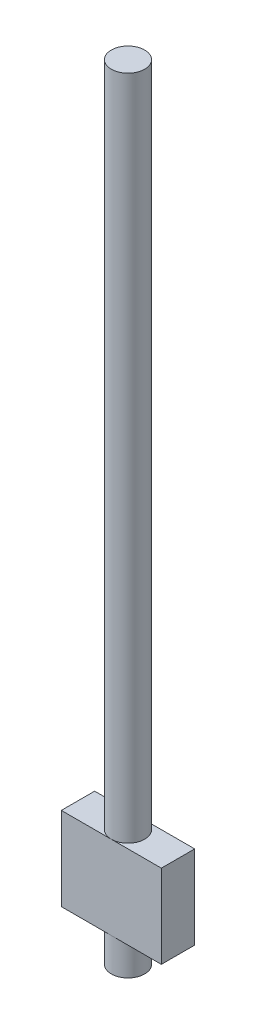
ISO-10303-21;
HEADER;
FILE_DESCRIPTION(('STEP AP214'),'2;1');
FILE_NAME('part.step','',(''),(''),'','','');
FILE_SCHEMA(('AUTOMOTIVE_DESIGN { 1 0 10303 214 1 1 1 1 }'));
ENDSEC;
DATA;
#1=APPLICATION_CONTEXT('core data for automotive mechanical design processes');
#2=APPLICATION_PROTOCOL_DEFINITION('international standard','automotive_design',2000,#1);
#3=PRODUCT_CONTEXT('',#1,'mechanical');
#4=PRODUCT('Part','Part','',(#3));
#5=PRODUCT_RELATED_PRODUCT_CATEGORY('part','',(#4));
#6=PRODUCT_DEFINITION_FORMATION('','',#4);
#7=PRODUCT_DEFINITION_CONTEXT('part definition',#1,'design');
#8=PRODUCT_DEFINITION('design','',#6,#7);
#9=PRODUCT_DEFINITION_SHAPE('','',#8);
#10=(LENGTH_UNIT() NAMED_UNIT(*) SI_UNIT(.MILLI.,.METRE.));
#11=(NAMED_UNIT(*) PLANE_ANGLE_UNIT() SI_UNIT($,.RADIAN.));
#12=(NAMED_UNIT(*) SI_UNIT($,.STERADIAN.) SOLID_ANGLE_UNIT());
#13=UNCERTAINTY_MEASURE_WITH_UNIT(LENGTH_MEASURE(1.E-05),#10,'distance_accuracy_value','');
#14=(GEOMETRIC_REPRESENTATION_CONTEXT(3) GLOBAL_UNCERTAINTY_ASSIGNED_CONTEXT((#13)) GLOBAL_UNIT_ASSIGNED_CONTEXT((#10,
#11,#12)) REPRESENTATION_CONTEXT('',''));
#15=CARTESIAN_POINT('',(0.,0.,0.));
#16=DIRECTION('',(0.,0.,1.));
#17=DIRECTION('',(1.,0.,0.));
#18=AXIS2_PLACEMENT_3D('',#15,#16,#17);
#19=CARTESIAN_POINT('',(0.,0.,0.));
#20=DIRECTION('',(0.,1.,0.));
#21=DIRECTION('',(0.,0.,1.));
#22=AXIS2_PLACEMENT_3D('',#19,#20,#21);
#23=PLANE('',#22);
#24=CARTESIAN_POINT('',(0.,0.,0.));
#25=DIRECTION('',(0.,-1.,0.));
#26=DIRECTION('',(0.,0.,-1.));
#27=AXIS2_PLACEMENT_3D('',#24,#25,#26);
#28=CIRCLE('',#27,0.5);
#29=CARTESIAN_POINT('',(0.,0.,-0.5));
#30=VERTEX_POINT('',#29);
#31=CARTESIAN_POINT('',(0.,0.,0.5));
#32=VERTEX_POINT('',#31);
#33=EDGE_CURVE('E57',#30,#32,#28,.T.);
#34=ORIENTED_EDGE('',*,*,#33,.F.);
#35=DIRECTION('',(-1.,0.,0.));
#36=VECTOR('',#35,1.);
#37=CARTESIAN_POINT('',(-1.5,0.,-0.5));
#38=LINE('',#37,#36);
#39=CARTESIAN_POINT('',(1.5,0.,-0.5));
#40=VERTEX_POINT('',#39);
#41=EDGE_CURVE('E101',#40,#30,#38,.T.);
#42=ORIENTED_EDGE('',*,*,#41,.F.);
#43=DIRECTION('',(0.,0.,-1.));
#44=VECTOR('',#43,1.);
#45=CARTESIAN_POINT('',(1.5,0.,0.5));
#46=LINE('',#45,#44);
#47=CARTESIAN_POINT('',(1.5,0.,0.5));
#48=VERTEX_POINT('',#47);
#49=EDGE_CURVE('E118',#48,#40,#46,.T.);
#50=ORIENTED_EDGE('',*,*,#49,.F.);
#51=DIRECTION('',(1.,0.,0.));
#52=VECTOR('',#51,1.);
#53=CARTESIAN_POINT('',(-1.5,0.,0.5));
#54=LINE('',#53,#52);
#55=EDGE_CURVE('E120',#32,#48,#54,.T.);
#56=ORIENTED_EDGE('',*,*,#55,.F.);
#57=EDGE_LOOP('',(#34,#42,#50,#56));
#58=FACE_BOUND('',#57,.T.);
#59=ADVANCED_FACE('F45',(#58),#23,.F.);
#60=CARTESIAN_POINT('',(0.,2.5,0.));
#61=DIRECTION('',(0.,1.,0.));
#62=DIRECTION('',(0.,0.,1.));
#63=AXIS2_PLACEMENT_3D('',#60,#61,#62);
#64=PLANE('',#63);
#65=CARTESIAN_POINT('',(0.,2.5,0.));
#66=DIRECTION('',(0.,1.,0.));
#67=DIRECTION('',(0.,0.,1.));
#68=AXIS2_PLACEMENT_3D('',#65,#66,#67);
#69=CIRCLE('',#68,0.5);
#70=CARTESIAN_POINT('',(0.,2.5,0.5));
#71=VERTEX_POINT('',#70);
#72=CARTESIAN_POINT('',(0.,2.5,-0.5));
#73=VERTEX_POINT('',#72);
#74=EDGE_CURVE('E198',#71,#73,#69,.T.);
#75=ORIENTED_EDGE('',*,*,#74,.F.);
#76=DIRECTION('',(1.,0.,0.));
#77=VECTOR('',#76,1.);
#78=CARTESIAN_POINT('',(-1.5,2.5,0.5));
#79=LINE('',#78,#77);
#80=CARTESIAN_POINT('',(1.5,2.5,0.5));
#81=VERTEX_POINT('',#80);
#82=EDGE_CURVE('E186',#71,#81,#79,.T.);
#83=ORIENTED_EDGE('',*,*,#82,.T.);
#84=DIRECTION('',(0.,0.,-1.));
#85=VECTOR('',#84,1.);
#86=CARTESIAN_POINT('',(1.5,2.5,0.5));
#87=LINE('',#86,#85);
#88=CARTESIAN_POINT('',(1.5,2.5,-0.5));
#89=VERTEX_POINT('',#88);
#90=EDGE_CURVE('E222',#81,#89,#87,.T.);
#91=ORIENTED_EDGE('',*,*,#90,.T.);
#92=DIRECTION('',(-1.,0.,0.));
#93=VECTOR('',#92,1.);
#94=CARTESIAN_POINT('',(-1.5,2.5,-0.5));
#95=LINE('',#94,#93);
#96=EDGE_CURVE('E220',#89,#73,#95,.T.);
#97=ORIENTED_EDGE('',*,*,#96,.T.);
#98=EDGE_LOOP('',(#75,#83,#91,#97));
#99=FACE_BOUND('',#98,.T.);
#100=ADVANCED_FACE('F143',(#99),#64,.T.);
#101=CARTESIAN_POINT('',(-1.5,2.5,0.5));
#102=DIRECTION('',(0.,0.,-1.));
#103=DIRECTION('',(-1.,0.,0.));
#104=AXIS2_PLACEMENT_3D('',#101,#102,#103);
#105=PLANE('',#104);
#106=CARTESIAN_POINT('',(-1.5,0.,0.5));
#107=VERTEX_POINT('',#106);
#108=EDGE_CURVE('E178',#107,#32,#54,.T.);
#109=ORIENTED_EDGE('',*,*,#108,.T.);
#110=ORIENTED_EDGE('',*,*,#55,.T.);
#111=DIRECTION('',(0.,-1.,0.));
#112=VECTOR('',#111,1.);
#113=CARTESIAN_POINT('',(1.5,2.5,0.5));
#114=LINE('',#113,#112);
#115=EDGE_CURVE('E49',#81,#48,#114,.T.);
#116=ORIENTED_EDGE('',*,*,#115,.F.);
#117=ORIENTED_EDGE('',*,*,#82,.F.);
#118=CARTESIAN_POINT('',(-1.5,2.5,0.5));
#119=VERTEX_POINT('',#118);
#120=EDGE_CURVE('E216',#119,#71,#79,.T.);
#121=ORIENTED_EDGE('',*,*,#120,.F.);
#122=DIRECTION('',(0.,-1.,0.));
#123=VECTOR('',#122,1.);
#124=CARTESIAN_POINT('',(-1.5,2.5,0.5));
#125=LINE('',#124,#123);
#126=EDGE_CURVE('E187',#119,#107,#125,.T.);
#127=ORIENTED_EDGE('',*,*,#126,.T.);
#128=EDGE_LOOP('',(#109,#110,#116,#117,#121,#127));
#129=FACE_BOUND('',#128,.T.);
#130=ADVANCED_FACE('F47',(#129),#105,.F.);
#131=CARTESIAN_POINT('',(1.5,2.5,0.5));
#132=DIRECTION('',(-1.,0.,0.));
#133=DIRECTION('',(0.,0.,1.));
#134=AXIS2_PLACEMENT_3D('',#131,#132,#133);
#135=PLANE('',#134);
#136=ORIENTED_EDGE('',*,*,#49,.T.);
#137=DIRECTION('',(0.,-1.,0.));
#138=VECTOR('',#137,1.);
#139=CARTESIAN_POINT('',(1.5,2.5,-0.5));
#140=LINE('',#139,#138);
#141=EDGE_CURVE('E108',#89,#40,#140,.T.);
#142=ORIENTED_EDGE('',*,*,#141,.F.);
#143=ORIENTED_EDGE('',*,*,#90,.F.);
#144=ORIENTED_EDGE('',*,*,#115,.T.);
#145=EDGE_LOOP('',(#136,#142,#143,#144));
#146=FACE_BOUND('',#145,.T.);
#147=ADVANCED_FACE('F168',(#146),#135,.F.);
#148=CARTESIAN_POINT('',(-1.5,2.5,-0.5));
#149=DIRECTION('',(0.,0.,1.));
#150=DIRECTION('',(1.,0.,0.));
#151=AXIS2_PLACEMENT_3D('',#148,#149,#150);
#152=PLANE('',#151);
#153=ORIENTED_EDGE('',*,*,#41,.T.);
#154=CARTESIAN_POINT('',(-1.5,0.,-0.5));
#155=VERTEX_POINT('',#154);
#156=EDGE_CURVE('E104',#30,#155,#38,.T.);
#157=ORIENTED_EDGE('',*,*,#156,.T.);
#158=DIRECTION('',(0.,-1.,0.));
#159=VECTOR('',#158,1.);
#160=CARTESIAN_POINT('',(-1.5,2.5,-0.5));
#161=LINE('',#160,#159);
#162=CARTESIAN_POINT('',(-1.5,2.5,-0.5));
#163=VERTEX_POINT('',#162);
#164=EDGE_CURVE('E191',#163,#155,#161,.T.);
#165=ORIENTED_EDGE('',*,*,#164,.F.);
#166=EDGE_CURVE('E218',#73,#163,#95,.T.);
#167=ORIENTED_EDGE('',*,*,#166,.F.);
#168=ORIENTED_EDGE('',*,*,#96,.F.);
#169=ORIENTED_EDGE('',*,*,#141,.T.);
#170=EDGE_LOOP('',(#153,#157,#165,#167,#168,#169));
#171=FACE_BOUND('',#170,.T.);
#172=ADVANCED_FACE('F102',(#171),#152,.F.);
#173=CARTESIAN_POINT('',(-1.5,2.5,0.5));
#174=DIRECTION('',(1.,0.,0.));
#175=DIRECTION('',(0.,0.,-1.));
#176=AXIS2_PLACEMENT_3D('',#173,#174,#175);
#177=PLANE('',#176);
#178=DIRECTION('',(0.,0.,1.));
#179=VECTOR('',#178,1.);
#180=CARTESIAN_POINT('',(-1.5,0.,0.5));
#181=LINE('',#180,#179);
#182=EDGE_CURVE('E113',#155,#107,#181,.T.);
#183=ORIENTED_EDGE('',*,*,#182,.T.);
#184=ORIENTED_EDGE('',*,*,#126,.F.);
#185=DIRECTION('',(0.,0.,1.));
#186=VECTOR('',#185,1.);
#187=CARTESIAN_POINT('',(-1.5,2.5,0.5));
#188=LINE('',#187,#186);
#189=EDGE_CURVE('E192',#163,#119,#188,.T.);
#190=ORIENTED_EDGE('',*,*,#189,.F.);
#191=ORIENTED_EDGE('',*,*,#164,.T.);
#192=EDGE_LOOP('',(#183,#184,#190,#191));
#193=FACE_BOUND('',#192,.T.);
#194=ADVANCED_FACE('F160',(#193),#177,.F.);
#195=EDGE_CURVE('E55',#73,#71,#69,.T.);
#196=ORIENTED_EDGE('',*,*,#195,.F.);
#197=ORIENTED_EDGE('',*,*,#166,.T.);
#198=ORIENTED_EDGE('',*,*,#189,.T.);
#199=ORIENTED_EDGE('',*,*,#120,.T.);
#200=EDGE_LOOP('',(#196,#197,#198,#199));
#201=FACE_BOUND('',#200,.T.);
#202=ADVANCED_FACE('F151',(#201),#64,.T.);
#203=EDGE_CURVE('E11',#32,#30,#28,.T.);
#204=ORIENTED_EDGE('',*,*,#203,.F.);
#205=ORIENTED_EDGE('',*,*,#108,.F.);
#206=ORIENTED_EDGE('',*,*,#182,.F.);
#207=ORIENTED_EDGE('',*,*,#156,.F.);
#208=EDGE_LOOP('',(#204,#205,#206,#207));
#209=FACE_BOUND('',#208,.T.);
#210=ADVANCED_FACE('F116',(#209),#23,.F.);
#211=CARTESIAN_POINT('',(0.,22.5,0.));
#212=DIRECTION('',(0.,-1.,0.));
#213=DIRECTION('',(0.,0.,-1.));
#214=AXIS2_PLACEMENT_3D('',#211,#212,#213);
#215=CYLINDRICAL_SURFACE('',#214,0.5);
#216=CARTESIAN_POINT('',(0.,22.5,0.));
#217=DIRECTION('',(0.,1.,0.));
#218=DIRECTION('',(0.,0.,1.));
#219=AXIS2_PLACEMENT_3D('',#216,#217,#218);
#220=CIRCLE('',#219,0.5);
#221=CARTESIAN_POINT('',(0.,22.5,0.5));
#222=VERTEX_POINT('',#221);
#223=EDGE_CURVE('E204',#222,#222,#220,.T.);
#224=ORIENTED_EDGE('',*,*,#223,.F.);
#225=EDGE_LOOP('',(#224));
#226=FACE_BOUND('',#225,.T.);
#227=ORIENTED_EDGE('',*,*,#74,.T.);
#228=ORIENTED_EDGE('',*,*,#195,.T.);
#229=EDGE_LOOP('',(#227,#228));
#230=FACE_BOUND('',#229,.T.);
#231=ADVANCED_FACE('F138',(#226,#230),#215,.T.);
#232=CARTESIAN_POINT('',(0.,22.5,0.));
#233=DIRECTION('',(0.,1.,0.));
#234=DIRECTION('',(0.,0.,1.));
#235=AXIS2_PLACEMENT_3D('',#232,#233,#234);
#236=PLANE('',#235);
#237=ORIENTED_EDGE('',*,*,#223,.T.);
#238=EDGE_LOOP('',(#237));
#239=FACE_BOUND('',#238,.T.);
#240=ADVANCED_FACE('F128',(#239),#236,.T.);
#241=CARTESIAN_POINT('',(0.,-1.,0.));
#242=DIRECTION('',(0.,1.,0.));
#243=DIRECTION('',(0.,0.,1.));
#244=AXIS2_PLACEMENT_3D('',#241,#242,#243);
#245=CYLINDRICAL_SURFACE('',#244,0.5);
#246=CARTESIAN_POINT('',(0.,-1.,0.));
#247=DIRECTION('',(0.,-1.,0.));
#248=DIRECTION('',(0.,0.,-1.));
#249=AXIS2_PLACEMENT_3D('',#246,#247,#248);
#250=CIRCLE('',#249,0.5);
#251=CARTESIAN_POINT('',(0.,-1.,-0.5));
#252=VERTEX_POINT('',#251);
#253=EDGE_CURVE('E124',#252,#252,#250,.T.);
#254=ORIENTED_EDGE('',*,*,#253,.F.);
#255=EDGE_LOOP('',(#254));
#256=FACE_BOUND('',#255,.T.);
#257=ORIENTED_EDGE('',*,*,#33,.T.);
#258=ORIENTED_EDGE('',*,*,#203,.T.);
#259=EDGE_LOOP('',(#257,#258));
#260=FACE_BOUND('',#259,.T.);
#261=ADVANCED_FACE('F125',(#256,#260),#245,.T.);
#262=CARTESIAN_POINT('',(0.,-1.,0.));
#263=DIRECTION('',(0.,-1.,0.));
#264=DIRECTION('',(0.,0.,-1.));
#265=AXIS2_PLACEMENT_3D('',#262,#263,#264);
#266=PLANE('',#265);
#267=ORIENTED_EDGE('',*,*,#253,.T.);
#268=EDGE_LOOP('',(#267));
#269=FACE_BOUND('',#268,.T.);
#270=ADVANCED_FACE('F127',(#269),#266,.T.);
#271=CLOSED_SHELL('',(#59,#100,#130,#147,#172,#194,#202,#210,#231,#240,#261,#270));
#272=MANIFOLD_SOLID_BREP('B2',#271);
#273=ADVANCED_BREP_SHAPE_REPRESENTATION('',(#18,#272),#14);
#274=SHAPE_DEFINITION_REPRESENTATION(#9,#273);
ENDSEC;
END-ISO-10303-21;
